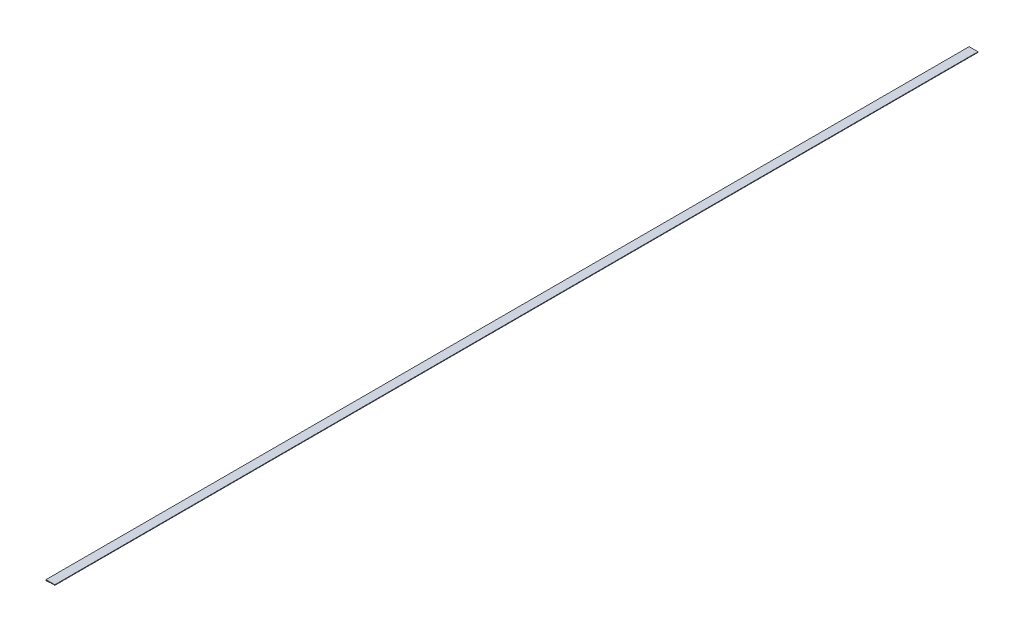
ISO-10303-21;
HEADER;
FILE_DESCRIPTION(('STEP AP214'),'2;1');
FILE_NAME('part.step','',(''),(''),'','','');
FILE_SCHEMA(('AUTOMOTIVE_DESIGN { 1 0 10303 214 1 1 1 1 }'));
ENDSEC;
DATA;
#1=APPLICATION_CONTEXT('core data for automotive mechanical design processes');
#2=APPLICATION_PROTOCOL_DEFINITION('international standard','automotive_design',2000,#1);
#3=PRODUCT_CONTEXT('',#1,'mechanical');
#4=PRODUCT('Part','Part','',(#3));
#5=PRODUCT_RELATED_PRODUCT_CATEGORY('part','',(#4));
#6=PRODUCT_DEFINITION_FORMATION('','',#4);
#7=PRODUCT_DEFINITION_CONTEXT('part definition',#1,'design');
#8=PRODUCT_DEFINITION('design','',#6,#7);
#9=PRODUCT_DEFINITION_SHAPE('','',#8);
#10=(LENGTH_UNIT() NAMED_UNIT(*) SI_UNIT(.MILLI.,.METRE.));
#11=(NAMED_UNIT(*) PLANE_ANGLE_UNIT() SI_UNIT($,.RADIAN.));
#12=(NAMED_UNIT(*) SI_UNIT($,.STERADIAN.) SOLID_ANGLE_UNIT());
#13=UNCERTAINTY_MEASURE_WITH_UNIT(LENGTH_MEASURE(1.E-05),#10,'distance_accuracy_value','');
#14=(GEOMETRIC_REPRESENTATION_CONTEXT(3) GLOBAL_UNCERTAINTY_ASSIGNED_CONTEXT((#13)) GLOBAL_UNIT_ASSIGNED_CONTEXT((#10,
#11,#12)) REPRESENTATION_CONTEXT('',''));
#15=CARTESIAN_POINT('',(0.,0.,0.));
#16=DIRECTION('',(0.,0.,1.));
#17=DIRECTION('',(1.,0.,0.));
#18=AXIS2_PLACEMENT_3D('',#15,#16,#17);
#19=CARTESIAN_POINT('',(17.3805758928834,25.399999999979,-5264.68671163173));
#20=DIRECTION('',(0.,-1.,0.));
#21=DIRECTION('',(0.,0.,-1.));
#22=AXIS2_PLACEMENT_3D('',#19,#20,#21);
#23=PLANE('',#22);
#24=DIRECTION('',(-1.,0.,0.));
#25=VECTOR('',#24,1.);
#26=CARTESIAN_POINT('',(17.3805758928834,25.399999999979,-5214.39999999999));
#27=LINE('',#26,#25);
#28=CARTESIAN_POINT('',(17.3805758928834,25.399999999979,-5214.39999999999));
#29=VERTEX_POINT('',#28);
#30=CARTESIAN_POINT('',(-7.6194241071166,25.399999999979,-5214.39999999999));
#31=VERTEX_POINT('',#30);
#32=EDGE_CURVE('E40',#29,#31,#27,.T.);
#33=ORIENTED_EDGE('',*,*,#32,.F.);
#34=DIRECTION('',(0.,0.,1.));
#35=VECTOR('',#34,1.);
#36=CARTESIAN_POINT('',(17.3805758928834,25.399999999979,-5264.68671163173));
#37=LINE('',#36,#35);
#38=CARTESIAN_POINT('',(17.3805758928834,25.399999999979,0.));
#39=VERTEX_POINT('',#38);
#40=EDGE_CURVE('E73',#29,#39,#37,.T.);
#41=ORIENTED_EDGE('',*,*,#40,.T.);
#42=DIRECTION('',(1.,0.,0.));
#43=VECTOR('',#42,1.);
#44=CARTESIAN_POINT('',(17.3805758928834,25.399999999979,0.));
#45=LINE('',#44,#43);
#46=CARTESIAN_POINT('',(-7.6194241071166,25.399999999979,0.));
#47=VERTEX_POINT('',#46);
#48=EDGE_CURVE('E77',#47,#39,#45,.T.);
#49=ORIENTED_EDGE('',*,*,#48,.F.);
#50=DIRECTION('',(0.,0.,1.));
#51=VECTOR('',#50,1.);
#52=CARTESIAN_POINT('',(-7.6194241071166,25.399999999979,-5264.68671163173));
#53=LINE('',#52,#51);
#54=EDGE_CURVE('E104',#31,#47,#53,.T.);
#55=ORIENTED_EDGE('',*,*,#54,.F.);
#56=EDGE_LOOP('',(#33,#41,#49,#55));
#57=FACE_BOUND('',#56,.T.);
#58=ADVANCED_FACE('F32',(#57),#23,.T.);
#59=CARTESIAN_POINT('',(-7.6194241071166,25.399999999979,-5264.68671163173));
#60=DIRECTION('',(0.0871557427300869,-0.996194698093283,0.));
#61=DIRECTION('',(0.996194698093283,0.0871557427300869,0.));
#62=AXIS2_PLACEMENT_3D('',#59,#60,#61);
#63=PLANE('',#62);
#64=DIRECTION('',(-0.996194698093283,-0.0871557427300869,0.));
#65=VECTOR('',#64,1.);
#66=CARTESIAN_POINT('',(-7.61942410711661,25.399999999979,-5214.39999999999));
#67=LINE('',#66,#65);
#68=CARTESIAN_POINT('',(-32.6194241071166,23.2127834122753,-5214.39999999999));
#69=VERTEX_POINT('',#68);
#70=EDGE_CURVE('E121',#31,#69,#67,.T.);
#71=ORIENTED_EDGE('',*,*,#70,.F.);
#72=ORIENTED_EDGE('',*,*,#54,.T.);
#73=DIRECTION('',(0.996194698093283,0.0871557427300869,0.));
#74=VECTOR('',#73,1.);
#75=CARTESIAN_POINT('',(-7.6194241071166,25.399999999979,0.));
#76=LINE('',#75,#74);
#77=CARTESIAN_POINT('',(-32.6194241071166,23.2127834122753,0.));
#78=VERTEX_POINT('',#77);
#79=EDGE_CURVE('E83',#78,#47,#76,.T.);
#80=ORIENTED_EDGE('',*,*,#79,.F.);
#81=DIRECTION('',(0.,0.,1.));
#82=VECTOR('',#81,1.);
#83=CARTESIAN_POINT('',(-32.6194241071166,23.2127834122753,-5264.68671163173));
#84=LINE('',#83,#82);
#85=EDGE_CURVE('E107',#69,#78,#84,.T.);
#86=ORIENTED_EDGE('',*,*,#85,.F.);
#87=EDGE_LOOP('',(#71,#72,#80,#86));
#88=FACE_BOUND('',#87,.T.);
#89=ADVANCED_FACE('F120',(#88),#63,.T.);
#90=CARTESIAN_POINT('',(-32.6194241071166,28.574999999979,-5264.68671163173));
#91=DIRECTION('',(-1.,0.,0.));
#92=DIRECTION('',(0.,-1.,0.));
#93=AXIS2_PLACEMENT_3D('',#90,#91,#92);
#94=PLANE('',#93);
#95=DIRECTION('',(0.,1.,0.));
#96=VECTOR('',#95,1.);
#97=CARTESIAN_POINT('',(-32.6194241071166,28.5749999999789,-5214.39999999999));
#98=LINE('',#97,#96);
#99=CARTESIAN_POINT('',(-32.6194241071166,28.574999999979,-5214.39999999999));
#100=VERTEX_POINT('',#99);
#101=EDGE_CURVE('E47',#69,#100,#98,.T.);
#102=ORIENTED_EDGE('',*,*,#101,.F.);
#103=ORIENTED_EDGE('',*,*,#85,.T.);
#104=DIRECTION('',(0.,-1.,0.));
#105=VECTOR('',#104,1.);
#106=CARTESIAN_POINT('',(-32.6194241071166,28.574999999979,0.));
#107=LINE('',#106,#105);
#108=CARTESIAN_POINT('',(-32.6194241071166,28.574999999979,0.));
#109=VERTEX_POINT('',#108);
#110=EDGE_CURVE('E101',#109,#78,#107,.T.);
#111=ORIENTED_EDGE('',*,*,#110,.F.);
#112=DIRECTION('',(0.,0.,1.));
#113=VECTOR('',#112,1.);
#114=CARTESIAN_POINT('',(-32.6194241071166,28.574999999979,-5264.68671163173));
#115=LINE('',#114,#113);
#116=EDGE_CURVE('E109',#100,#109,#115,.T.);
#117=ORIENTED_EDGE('',*,*,#116,.F.);
#118=EDGE_LOOP('',(#102,#103,#111,#117));
#119=FACE_BOUND('',#118,.T.);
#120=ADVANCED_FACE('F116',(#119),#94,.T.);
#121=CARTESIAN_POINT('',(17.3805758928834,28.574999999979,-5264.68671163173));
#122=DIRECTION('',(0.,1.,0.));
#123=DIRECTION('',(0.,0.,1.));
#124=AXIS2_PLACEMENT_3D('',#121,#122,#123);
#125=PLANE('',#124);
#126=DIRECTION('',(1.,0.,0.));
#127=VECTOR('',#126,1.);
#128=CARTESIAN_POINT('',(17.3805758928834,28.574999999979,-5214.39999999999));
#129=LINE('',#128,#127);
#130=CARTESIAN_POINT('',(17.3805758928834,28.574999999979,-5214.39999999999));
#131=VERTEX_POINT('',#130);
#132=EDGE_CURVE('E106',#100,#131,#129,.T.);
#133=ORIENTED_EDGE('',*,*,#132,.F.);
#134=ORIENTED_EDGE('',*,*,#116,.T.);
#135=DIRECTION('',(-1.,0.,0.));
#136=VECTOR('',#135,1.);
#137=CARTESIAN_POINT('',(17.3805758928834,28.574999999979,0.));
#138=LINE('',#137,#136);
#139=CARTESIAN_POINT('',(17.3805758928834,28.574999999979,0.));
#140=VERTEX_POINT('',#139);
#141=EDGE_CURVE('E91',#140,#109,#138,.T.);
#142=ORIENTED_EDGE('',*,*,#141,.F.);
#143=DIRECTION('',(0.,0.,1.));
#144=VECTOR('',#143,1.);
#145=CARTESIAN_POINT('',(17.3805758928834,28.574999999979,-5264.68671163173));
#146=LINE('',#145,#144);
#147=EDGE_CURVE('E82',#131,#140,#146,.T.);
#148=ORIENTED_EDGE('',*,*,#147,.F.);
#149=EDGE_LOOP('',(#133,#134,#142,#148));
#150=FACE_BOUND('',#149,.T.);
#151=ADVANCED_FACE('F114',(#150),#125,.T.);
#152=CARTESIAN_POINT('',(17.3805758928834,25.399999999979,-5264.68671163173));
#153=DIRECTION('',(1.,0.,0.));
#154=DIRECTION('',(0.,1.,0.));
#155=AXIS2_PLACEMENT_3D('',#152,#153,#154);
#156=PLANE('',#155);
#157=DIRECTION('',(0.,-1.,0.));
#158=VECTOR('',#157,1.);
#159=CARTESIAN_POINT('',(17.3805758928834,25.3999999999789,-5214.39999999999));
#160=LINE('',#159,#158);
#161=EDGE_CURVE('E11',#131,#29,#160,.T.);
#162=ORIENTED_EDGE('',*,*,#161,.F.);
#163=ORIENTED_EDGE('',*,*,#147,.T.);
#164=DIRECTION('',(0.,1.,0.));
#165=VECTOR('',#164,1.);
#166=CARTESIAN_POINT('',(17.3805758928834,25.399999999979,0.));
#167=LINE('',#166,#165);
#168=EDGE_CURVE('E85',#39,#140,#167,.T.);
#169=ORIENTED_EDGE('',*,*,#168,.F.);
#170=ORIENTED_EDGE('',*,*,#40,.F.);
#171=EDGE_LOOP('',(#162,#163,#169,#170));
#172=FACE_BOUND('',#171,.T.);
#173=ADVANCED_FACE('F86',(#172),#156,.T.);
#174=CARTESIAN_POINT('',(0.,0.,0.));
#175=DIRECTION('',(0.,0.,1.));
#176=DIRECTION('',(1.,0.,0.));
#177=AXIS2_PLACEMENT_3D('',#174,#175,#176);
#178=PLANE('',#177);
#179=ORIENTED_EDGE('',*,*,#48,.T.);
#180=ORIENTED_EDGE('',*,*,#168,.T.);
#181=ORIENTED_EDGE('',*,*,#141,.T.);
#182=ORIENTED_EDGE('',*,*,#110,.T.);
#183=ORIENTED_EDGE('',*,*,#79,.T.);
#184=EDGE_LOOP('',(#179,#180,#181,#182,#183));
#185=FACE_BOUND('',#184,.T.);
#186=ADVANCED_FACE('F93',(#185),#178,.T.);
#187=CARTESIAN_POINT('',(-2103.00317746454,-160.701499756956,-5214.39999999999));
#188=DIRECTION('',(0.,0.,1.));
#189=DIRECTION('',(-0.0871557427476582,0.996194698091746,0.));
#190=AXIS2_PLACEMENT_3D('',#187,#188,#189);
#191=PLANE('',#190);
#192=ORIENTED_EDGE('',*,*,#32,.T.);
#193=ORIENTED_EDGE('',*,*,#70,.T.);
#194=ORIENTED_EDGE('',*,*,#101,.T.);
#195=ORIENTED_EDGE('',*,*,#132,.T.);
#196=ORIENTED_EDGE('',*,*,#161,.T.);
#197=EDGE_LOOP('',(#192,#193,#194,#195,#196));
#198=FACE_BOUND('',#197,.T.);
#199=ADVANCED_FACE('F122',(#198),#191,.F.);
#200=CLOSED_SHELL('',(#58,#89,#120,#151,#173,#186,#199));
#201=MANIFOLD_SOLID_BREP('B2',#200);
#202=ADVANCED_BREP_SHAPE_REPRESENTATION('',(#18,#201),#14);
#203=SHAPE_DEFINITION_REPRESENTATION(#9,#202);
ENDSEC;
END-ISO-10303-21;
